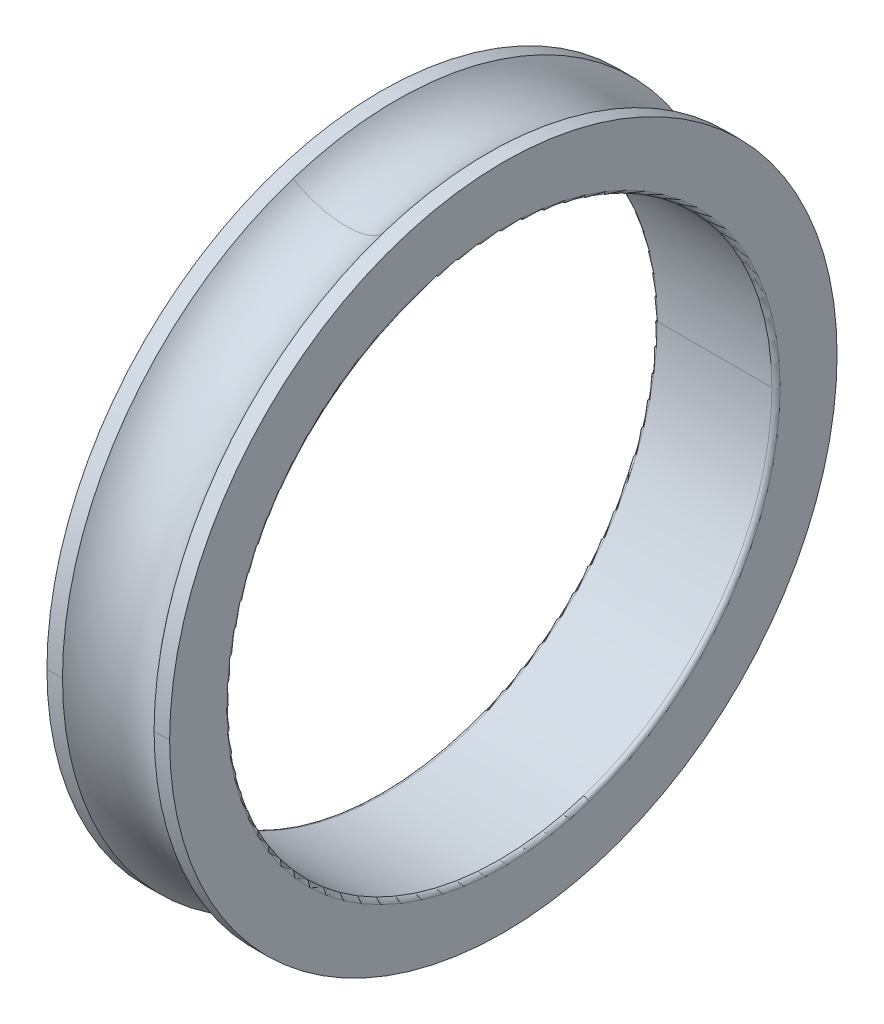
ISO-10303-21;
HEADER;
FILE_DESCRIPTION(('STEP AP214'),'2;1');
FILE_NAME('part.step','',(''),(''),'','','');
FILE_SCHEMA(('AUTOMOTIVE_DESIGN { 1 0 10303 214 1 1 1 1 }'));
ENDSEC;
DATA;
#1=APPLICATION_CONTEXT('core data for automotive mechanical design processes');
#2=APPLICATION_PROTOCOL_DEFINITION('international standard','automotive_design',2000,#1);
#3=PRODUCT_CONTEXT('',#1,'mechanical');
#4=PRODUCT('Part','Part','',(#3));
#5=PRODUCT_RELATED_PRODUCT_CATEGORY('part','',(#4));
#6=PRODUCT_DEFINITION_FORMATION('','',#4);
#7=PRODUCT_DEFINITION_CONTEXT('part definition',#1,'design');
#8=PRODUCT_DEFINITION('design','',#6,#7);
#9=PRODUCT_DEFINITION_SHAPE('','',#8);
#10=(LENGTH_UNIT() NAMED_UNIT(*) SI_UNIT(.MILLI.,.METRE.));
#11=(NAMED_UNIT(*) PLANE_ANGLE_UNIT() SI_UNIT($,.RADIAN.));
#12=(NAMED_UNIT(*) SI_UNIT($,.STERADIAN.) SOLID_ANGLE_UNIT());
#13=UNCERTAINTY_MEASURE_WITH_UNIT(LENGTH_MEASURE(1.E-05),#10,'distance_accuracy_value','');
#14=(GEOMETRIC_REPRESENTATION_CONTEXT(3) GLOBAL_UNCERTAINTY_ASSIGNED_CONTEXT((#13)) GLOBAL_UNIT_ASSIGNED_CONTEXT((#10,
#11,#12)) REPRESENTATION_CONTEXT('',''));
#15=CARTESIAN_POINT('',(0.,0.,0.));
#16=DIRECTION('',(0.,0.,1.));
#17=DIRECTION('',(1.,0.,0.));
#18=AXIS2_PLACEMENT_3D('',#15,#16,#17);
#19=CARTESIAN_POINT('',(0.,24.48,0.));
#20=DIRECTION('',(-1.,0.,0.));
#21=DIRECTION('',(0.,0.,1.));
#22=AXIS2_PLACEMENT_3D('',#19,#20,#21);
#23=PLANE('',#22);
#24=CARTESIAN_POINT('',(0.,0.,0.));
#25=DIRECTION('',(1.,0.,0.));
#26=DIRECTION('',(0.,0.,-1.));
#27=AXIS2_PLACEMENT_3D('',#24,#25,#26);
#28=CIRCLE('',#27,20.3);
#29=CARTESIAN_POINT('',(0.,19.3064472807916,6.27304498581143));
#30=VERTEX_POINT('',#29);
#31=CARTESIAN_POINT('',(0.,-19.3064472807916,-6.27304498581143));
#32=VERTEX_POINT('',#31);
#33=EDGE_CURVE('E11',#30,#32,#28,.T.);
#34=ORIENTED_EDGE('',*,*,#33,.T.);
#35=CARTESIAN_POINT('',(0.,-19.3064472807916,-6.27304498581143));
#36=CARTESIAN_POINT('',(0.,-18.321039656806,-9.30566625738239));
#37=CARTESIAN_POINT('',(0.,-16.7404234910755,-12.1449871080467));
#38=CARTESIAN_POINT('',(0.,-14.6141709386433,-14.6343748217971));
#39=CARTESIAN_POINT('',(0.,-9.50019608369346,-18.645177524688));
#40=CARTESIAN_POINT('',(0.,-3.24946547282107,-20.4249998929224));
#41=CARTESIAN_POINT('',(0.,0.0142870830237632,-20.6818683552697));
#42=CARTESIAN_POINT('',(0.,6.46647707205312,-19.9017700281792));
#43=CARTESIAN_POINT('',(0.,12.1449387161157,-16.7403807115383));
#44=CARTESIAN_POINT('',(0.,14.6343865052819,-14.6141841407228));
#45=CARTESIAN_POINT('',(0.,18.645180456989,-9.50019032872872));
#46=CARTESIAN_POINT('',(0.,20.4249823448355,-3.24946378067093));
#47=CARTESIAN_POINT('',(0.,20.6819314087058,0.0142730783102607));
#48=CARTESIAN_POINT('',(0.,20.2917658258184,3.24039477073223));
#49=CARTESIAN_POINT('',(0.,19.3064472807916,6.27304498581143));
#50=B_SPLINE_CURVE_WITH_KNOTS('',5,(#35,#36,#37,#38,#39,#40,#41,#42,#43,#44,#45,#46,#47,#48,
#49),.UNSPECIFIED.,.F.,.F.,(6,3,3,3,6),(0.,0.785398163397448,1.5707963267949,2.35619449019234,
3.14159265358979),.UNSPECIFIED.);
#51=EDGE_CURVE('E26',#32,#30,#50,.T.);
#52=ORIENTED_EDGE('',*,*,#51,.T.);
#53=EDGE_LOOP('',(#34,#52));
#54=FACE_BOUND('',#53,.T.);
#55=CARTESIAN_POINT('',(0.,0.,0.));
#56=DIRECTION('',(1.,0.,0.));
#57=DIRECTION('',(0.,0.,-1.));
#58=AXIS2_PLACEMENT_3D('',#55,#56,#57);
#59=CIRCLE('',#58,24.48);
#60=CARTESIAN_POINT('',(0.,0.,24.48));
#61=VERTEX_POINT('',#60);
#62=CARTESIAN_POINT('',(0.,0.,-24.48));
#63=VERTEX_POINT('',#62);
#64=EDGE_CURVE('E318',#61,#63,#59,.T.);
#65=ORIENTED_EDGE('',*,*,#64,.F.);
#66=CARTESIAN_POINT('',(0.,0.,0.));
#67=DIRECTION('',(1.,0.,0.));
#68=DIRECTION('',(0.,0.,-1.));
#69=AXIS2_PLACEMENT_3D('',#66,#67,#68);
#70=CIRCLE('',#69,24.48);
#71=EDGE_CURVE('E313',#63,#61,#70,.T.);
#72=ORIENTED_EDGE('',*,*,#71,.F.);
#73=EDGE_LOOP('',(#65,#72));
#74=FACE_BOUND('',#73,.T.);
#75=ADVANCED_FACE('F17',(#54,#74),#23,.T.);
#76=CARTESIAN_POINT('',(9.,0.,0.));
#77=DIRECTION('',(1.,0.,0.));
#78=DIRECTION('',(0.,-1.,0.));
#79=AXIS2_PLACEMENT_3D('',#76,#77,#78);
#80=CYLINDRICAL_SURFACE('',#79,24.48);
#81=DIRECTION('',(1.,0.,0.));
#82=VECTOR('',#81,1.);
#83=CARTESIAN_POINT('',(0.,0.,24.48));
#84=LINE('',#83,#82);
#85=CARTESIAN_POINT('',(1.14,0.,24.48));
#86=VERTEX_POINT('',#85);
#87=EDGE_CURVE('E309',#61,#86,#84,.T.);
#88=ORIENTED_EDGE('',*,*,#87,.T.);
#89=CARTESIAN_POINT('',(1.14,0.,0.));
#90=DIRECTION('',(1.,0.,0.));
#91=DIRECTION('',(0.,0.,-1.));
#92=AXIS2_PLACEMENT_3D('',#89,#90,#91);
#93=CIRCLE('',#92,24.48);
#94=CARTESIAN_POINT('',(1.14000000000001,23.2818635189054,7.56473602229871));
#95=VERTEX_POINT('',#94);
#96=EDGE_CURVE('E304',#95,#86,#93,.T.);
#97=ORIENTED_EDGE('',*,*,#96,.F.);
#98=CARTESIAN_POINT('',(1.14,0.,0.));
#99=DIRECTION('',(1.,0.,0.));
#100=DIRECTION('',(0.,0.,-1.));
#101=AXIS2_PLACEMENT_3D('',#98,#99,#100);
#102=CIRCLE('',#101,24.48);
#103=CARTESIAN_POINT('',(1.14,0.,-24.48));
#104=VERTEX_POINT('',#103);
#105=EDGE_CURVE('E299',#104,#95,#102,.T.);
#106=ORIENTED_EDGE('',*,*,#105,.F.);
#107=DIRECTION('',(1.,0.,0.));
#108=VECTOR('',#107,1.);
#109=CARTESIAN_POINT('',(0.,0.,-24.48));
#110=LINE('',#109,#108);
#111=EDGE_CURVE('E294',#63,#104,#110,.T.);
#112=ORIENTED_EDGE('',*,*,#111,.F.);
#113=ORIENTED_EDGE('',*,*,#71,.T.);
#114=EDGE_LOOP('',(#88,#97,#106,#112,#113));
#115=FACE_BOUND('',#114,.T.);
#116=ADVANCED_FACE('F339',(#115),#80,.T.);
#117=CARTESIAN_POINT('',(9.,0.,0.));
#118=DIRECTION('',(1.,0.,0.));
#119=DIRECTION('',(0.,1.,0.));
#120=AXIS2_PLACEMENT_3D('',#117,#118,#119);
#121=CYLINDRICAL_SURFACE('',#120,24.48);
#122=ORIENTED_EDGE('',*,*,#87,.F.);
#123=ORIENTED_EDGE('',*,*,#64,.T.);
#124=ORIENTED_EDGE('',*,*,#111,.T.);
#125=CARTESIAN_POINT('',(1.14,0.,0.));
#126=DIRECTION('',(1.,0.,0.));
#127=DIRECTION('',(0.,0.,-1.));
#128=AXIS2_PLACEMENT_3D('',#125,#126,#127);
#129=CIRCLE('',#128,24.48);
#130=CARTESIAN_POINT('',(1.14000000000001,-23.2818635189054,-7.56473602229871));
#131=VERTEX_POINT('',#130);
#132=EDGE_CURVE('E289',#131,#104,#129,.T.);
#133=ORIENTED_EDGE('',*,*,#132,.F.);
#134=CARTESIAN_POINT('',(1.14,0.,0.));
#135=DIRECTION('',(1.,0.,0.));
#136=DIRECTION('',(0.,0.,-1.));
#137=AXIS2_PLACEMENT_3D('',#134,#135,#136);
#138=CIRCLE('',#137,24.48);
#139=EDGE_CURVE('E284',#86,#131,#138,.T.);
#140=ORIENTED_EDGE('',*,*,#139,.F.);
#141=EDGE_LOOP('',(#122,#123,#124,#133,#140));
#142=FACE_BOUND('',#141,.T.);
#143=ADVANCED_FACE('F334',(#142),#121,.T.);
#144=CARTESIAN_POINT('',(4.5,0.,0.));
#145=DIRECTION('',(1.,0.,0.));
#146=DIRECTION('',(0.,0.309016994374947,-0.951056516295154));
#147=AXIS2_PLACEMENT_3D('',#144,#145,#146);
#148=TOROIDAL_SURFACE('',#147,27.,4.2);
#149=CARTESIAN_POINT('',(4.5,-25.6785259399691,-8.34345884812357));
#150=DIRECTION('',(0.,0.309016994374947,-0.951056516295154));
#151=DIRECTION('',(-0.799999999999998,0.570633909777095,0.185410196624969));
#152=AXIS2_PLACEMENT_3D('',#149,#150,#151);
#153=CIRCLE('',#152,4.2);
#154=CARTESIAN_POINT('',(7.86,-23.2818635189054,-7.56473602229871));
#155=VERTEX_POINT('',#154);
#156=EDGE_CURVE('E280',#131,#155,#153,.T.);
#157=ORIENTED_EDGE('',*,*,#156,.T.);
#158=CARTESIAN_POINT('',(7.86,0.,0.));
#159=DIRECTION('',(1.,0.,0.));
#160=DIRECTION('',(0.,0.,-1.));
#161=AXIS2_PLACEMENT_3D('',#158,#159,#160);
#162=CIRCLE('',#161,24.48);
#163=CARTESIAN_POINT('',(7.86,0.,24.48));
#164=VERTEX_POINT('',#163);
#165=EDGE_CURVE('E275',#164,#155,#162,.T.);
#166=ORIENTED_EDGE('',*,*,#165,.F.);
#167=CARTESIAN_POINT('',(7.86,0.,0.));
#168=DIRECTION('',(1.,0.,0.));
#169=DIRECTION('',(0.,0.,-1.));
#170=AXIS2_PLACEMENT_3D('',#167,#168,#169);
#171=CIRCLE('',#170,24.48);
#172=CARTESIAN_POINT('',(7.86,23.2818635189054,7.56473602229871));
#173=VERTEX_POINT('',#172);
#174=EDGE_CURVE('E270',#173,#164,#171,.T.);
#175=ORIENTED_EDGE('',*,*,#174,.F.);
#176=CARTESIAN_POINT('',(4.5,25.6785259399691,8.34345884812358));
#177=DIRECTION('',(0.,-0.309016994374947,0.951056516295154));
#178=DIRECTION('',(-0.799999999999999,-0.570633909777094,-0.185410196624969));
#179=AXIS2_PLACEMENT_3D('',#176,#177,#178);
#180=CIRCLE('',#179,4.2);
#181=EDGE_CURVE('E265',#95,#173,#180,.T.);
#182=ORIENTED_EDGE('',*,*,#181,.F.);
#183=ORIENTED_EDGE('',*,*,#96,.T.);
#184=ORIENTED_EDGE('',*,*,#139,.T.);
#185=EDGE_LOOP('',(#157,#166,#175,#182,#183,#184));
#186=FACE_BOUND('',#185,.T.);
#187=ADVANCED_FACE('F346',(#186),#148,.F.);
#188=CARTESIAN_POINT('',(4.5,0.,0.));
#189=DIRECTION('',(1.,0.,0.));
#190=DIRECTION('',(0.,-0.309016994374947,0.951056516295154));
#191=AXIS2_PLACEMENT_3D('',#188,#189,#190);
#192=TOROIDAL_SURFACE('',#191,27.,4.2);
#193=ORIENTED_EDGE('',*,*,#156,.F.);
#194=ORIENTED_EDGE('',*,*,#132,.T.);
#195=ORIENTED_EDGE('',*,*,#105,.T.);
#196=ORIENTED_EDGE('',*,*,#181,.T.);
#197=CARTESIAN_POINT('',(7.86,0.,0.));
#198=DIRECTION('',(1.,0.,0.));
#199=DIRECTION('',(0.,0.,-1.));
#200=AXIS2_PLACEMENT_3D('',#197,#198,#199);
#201=CIRCLE('',#200,24.48);
#202=CARTESIAN_POINT('',(7.86,0.,-24.48));
#203=VERTEX_POINT('',#202);
#204=EDGE_CURVE('E260',#203,#173,#201,.T.);
#205=ORIENTED_EDGE('',*,*,#204,.F.);
#206=CARTESIAN_POINT('',(7.86,0.,0.));
#207=DIRECTION('',(1.,0.,0.));
#208=DIRECTION('',(0.,0.,-1.));
#209=AXIS2_PLACEMENT_3D('',#206,#207,#208);
#210=CIRCLE('',#209,24.48);
#211=EDGE_CURVE('E255',#155,#203,#210,.T.);
#212=ORIENTED_EDGE('',*,*,#211,.F.);
#213=EDGE_LOOP('',(#193,#194,#195,#196,#205,#212));
#214=FACE_BOUND('',#213,.T.);
#215=ADVANCED_FACE('F343',(#214),#192,.F.);
#216=CARTESIAN_POINT('',(9.,0.,0.));
#217=DIRECTION('',(1.,0.,0.));
#218=DIRECTION('',(0.,1.,0.));
#219=AXIS2_PLACEMENT_3D('',#216,#217,#218);
#220=CYLINDRICAL_SURFACE('',#219,24.48);
#221=DIRECTION('',(1.,0.,0.));
#222=VECTOR('',#221,1.);
#223=CARTESIAN_POINT('',(7.86,0.,24.48));
#224=LINE('',#223,#222);
#225=CARTESIAN_POINT('',(9.,0.,24.48));
#226=VERTEX_POINT('',#225);
#227=EDGE_CURVE('E250',#164,#226,#224,.T.);
#228=ORIENTED_EDGE('',*,*,#227,.F.);
#229=ORIENTED_EDGE('',*,*,#165,.T.);
#230=ORIENTED_EDGE('',*,*,#211,.T.);
#231=DIRECTION('',(1.,0.,0.));
#232=VECTOR('',#231,1.);
#233=CARTESIAN_POINT('',(7.86,0.,-24.48));
#234=LINE('',#233,#232);
#235=CARTESIAN_POINT('',(9.,0.,-24.48));
#236=VERTEX_POINT('',#235);
#237=EDGE_CURVE('E246',#203,#236,#234,.T.);
#238=ORIENTED_EDGE('',*,*,#237,.T.);
#239=CARTESIAN_POINT('',(9.,0.,0.));
#240=DIRECTION('',(1.,0.,0.));
#241=DIRECTION('',(0.,0.,-1.));
#242=AXIS2_PLACEMENT_3D('',#239,#240,#241);
#243=CIRCLE('',#242,24.48);
#244=EDGE_CURVE('E241',#226,#236,#243,.T.);
#245=ORIENTED_EDGE('',*,*,#244,.F.);
#246=EDGE_LOOP('',(#228,#229,#230,#238,#245));
#247=FACE_BOUND('',#246,.T.);
#248=ADVANCED_FACE('F353',(#247),#220,.T.);
#249=CARTESIAN_POINT('',(9.,20.3,0.));
#250=DIRECTION('',(1.,0.,0.));
#251=DIRECTION('',(0.,0.,-1.));
#252=AXIS2_PLACEMENT_3D('',#249,#250,#251);
#253=PLANE('',#252);
#254=CARTESIAN_POINT('',(9.,0.,0.));
#255=DIRECTION('',(1.,0.,0.));
#256=DIRECTION('',(0.,0.,-1.));
#257=AXIS2_PLACEMENT_3D('',#254,#255,#256);
#258=CIRCLE('',#257,24.48);
#259=EDGE_CURVE('E238',#236,#226,#258,.T.);
#260=ORIENTED_EDGE('',*,*,#259,.T.);
#261=ORIENTED_EDGE('',*,*,#244,.T.);
#262=EDGE_LOOP('',(#260,#261));
#263=FACE_BOUND('',#262,.T.);
#264=CARTESIAN_POINT('',(9.,-19.3064472807916,-6.27304498581147));
#265=CARTESIAN_POINT('',(9.,-19.2038114196328,-6.58894848704194));
#266=CARTESIAN_POINT('',(9.,-19.0934092030368,-6.90232791603218));
#267=CARTESIAN_POINT('',(9.,-18.8573669791918,-7.52329467595277));
#268=CARTESIAN_POINT('',(9.,-18.7317269719428,-7.83088200688312));
#269=CARTESIAN_POINT('',(9.,-18.4655040870129,-8.43952061710446));
#270=CARTESIAN_POINT('',(9.,-18.3249212093321,-8.74057189639547));
#271=CARTESIAN_POINT('',(9.,-18.0291533386369,-9.3354139345546));
#272=CARTESIAN_POINT('',(9.,-17.8739683456225,-9.62920469342273));
#273=CARTESIAN_POINT('',(9.,-17.549369541533,-10.2088177113537));
#274=CARTESIAN_POINT('',(9.,-17.3799557304579,-10.4946399704165));
#275=CARTESIAN_POINT('',(9.,-17.027307572196,-11.0576274746076));
#276=CARTESIAN_POINT('',(9.,-16.8440732250091,-11.3347927197358));
#277=CARTESIAN_POINT('',(9.,-16.4642253821268,-11.8797984655052));
#278=CARTESIAN_POINT('',(9.,-16.2676118864314,-12.1476389661464));
#279=CARTESIAN_POINT('',(9.,-15.8614794163794,-12.6733499757884));
#280=CARTESIAN_POINT('',(9.,-15.6519604420228,-12.9312204847892));
#281=CARTESIAN_POINT('',(9.,-15.2205217613384,-13.4363702774163));
#282=CARTESIAN_POINT('',(9.,-14.9986020550105,-13.6836495610425));
#283=CARTESIAN_POINT('',(9.,-14.5428965351632,-14.1670211857594));
#284=CARTESIAN_POINT('',(9.,-14.3091107216437,-14.40311352685));
#285=CARTESIAN_POINT('',(9.,-13.8302361977091,-14.8635424992885));
#286=CARTESIAN_POINT('',(9.,-13.5851474872939,-15.0878791306363));
#287=CARTESIAN_POINT('',(9.,-13.0842576097936,-15.5242562370156));
#288=CARTESIAN_POINT('',(9.,-12.8284564427085,-15.7362967120471));
#289=CARTESIAN_POINT('',(9.,-12.3067578992707,-16.1475706817112));
#290=CARTESIAN_POINT('',(9.,-12.040860522918,-16.3468041763438));
#291=CARTESIAN_POINT('',(9.,-11.4996101310184,-16.7319842142723));
#292=CARTESIAN_POINT('',(9.,-11.2242571154715,-16.9179307575682));
#293=CARTESIAN_POINT('',(9.,-10.6647587947151,-17.2760889313131));
#294=CARTESIAN_POINT('',(9.,-10.3806134895055,-17.448300561762));
#295=CARTESIAN_POINT('',(9.,-9.80421512035229,-17.7785740369115));
#296=CARTESIAN_POINT('',(9.,-9.51196205640871,-17.9366358816119));
#297=CARTESIAN_POINT('',(9.,-8.92005223301687,-18.2382290004358));
#298=CARTESIAN_POINT('',(9.,-8.62039547356862,-18.3817602745593));
#299=CARTESIAN_POINT('',(9.,-8.01440015854779,-18.6539464728179));
#300=CARTESIAN_POINT('',(9.,-7.70806160297523,-18.7826013969531));
#301=CARTESIAN_POINT('',(9.,-7.08944069211824,-19.0247249542543));
#302=CARTESIAN_POINT('',(9.,-6.77715833683381,-19.1381935874202));
#303=CARTESIAN_POINT('',(9.,-6.1474021420997,-19.3496712069067));
#304=CARTESIAN_POINT('',(9.,-5.82992830265001,-19.4476801932274));
#305=CARTESIAN_POINT('',(9.,-5.19055396187201,-19.6280024067907));
#306=CARTESIAN_POINT('',(9.,-4.86865346054371,-19.7103156340334));
#307=CARTESIAN_POINT('',(9.,-4.22120128251134,-19.8590480296668));
#308=CARTESIAN_POINT('',(9.,-3.89564960580728,-19.9254671980574));
#309=CARTESIAN_POINT('',(9.,-3.24167935952753,-20.0422514663922));
#310=CARTESIAN_POINT('',(9.,-2.91326078995185,-20.0926165663364));
#311=CARTESIAN_POINT('',(9.,-2.25434794702904,-20.1771713638412));
#312=CARTESIAN_POINT('',(9.,-1.92385367368192,-20.2113610614018));
#313=CARTESIAN_POINT('',(9.,-1.2615856128686,-20.2634826881632));
#314=CARTESIAN_POINT('',(9.,-0.929811825402402,-20.2814146173641));
#315=CARTESIAN_POINT('',(9.,-0.265784008464907,-20.300977507818));
#316=CARTESIAN_POINT('',(9.,0.0664700210063933,-20.302608469071));
#317=CARTESIAN_POINT('',(9.,0.730657892895099,-20.2895654945008));
#318=CARTESIAN_POINT('',(9.,1.0625917353125,-20.2748915586775));
#319=CARTESIAN_POINT('',(9.,1.72533957539305,-20.2292741407513));
#320=CARTESIAN_POINT('',(9.,2.0561535730562,-20.1983306586484));
#321=CARTESIAN_POINT('',(9.,2.71586476373198,-20.1202486937216));
#322=CARTESIAN_POINT('',(9.,3.04476195674461,-20.0731102108978));
#323=CARTESIAN_POINT('',(9.,3.69984719597342,-19.9627518052631));
#324=CARTESIAN_POINT('',(9.,4.02603524218959,-19.8995318824523));
#325=CARTESIAN_POINT('',(9.,4.67491637225143,-19.7571628991751));
#326=CARTESIAN_POINT('',(9.,4.9976094560971,-19.6780138387088));
#327=CARTESIAN_POINT('',(9.,5.63872326551437,-19.50397725714));
#328=CARTESIAN_POINT('',(9.,5.95714399108597,-19.4090897360375));
#329=CARTESIAN_POINT('',(9.,6.58894598053685,-19.2038048255458));
#330=CARTESIAN_POINT('',(9.,6.90232724441613,-19.0934074361566));
#331=CARTESIAN_POINT('',(9.,7.52329534756872,-18.8573687460721));
#332=CARTESIAN_POINT('',(9.,7.83088218684203,-18.7317274453769));
#333=CARTESIAN_POINT('',(9.,8.43952043714545,-18.4655036135788));
#334=CARTESIAN_POINT('',(9.,8.74057184817556,-18.3249210824759));
#335=CARTESIAN_POINT('',(9.,9.33541398277441,-18.0291534654933));
#336=CARTESIAN_POINT('',(9.,9.62920470634315,-17.8739683796136));
#337=CARTESIAN_POINT('',(9.,10.2088176984332,-17.549369507542));
#338=CARTESIAN_POINT('',(9.,10.4946399669544,-17.3799557213501));
#339=CARTESIAN_POINT('',(9.,11.0576274780696,-17.0273075813039));
#340=CARTESIAN_POINT('',(9.,11.3347927206635,-16.8440732274495));
#341=CARTESIAN_POINT('',(9.,11.8797984645776,-16.4642253796863));
#342=CARTESIAN_POINT('',(9.,12.1476389658978,-16.2676118857775));
#343=CARTESIAN_POINT('',(9.,12.6733499760369,-15.8614794170334));
#344=CARTESIAN_POINT('',(9.,12.9312204848558,-15.6519604421981));
#345=CARTESIAN_POINT('',(9.,13.4363702773496,-15.2205217611632));
#346=CARTESIAN_POINT('',(9.,13.6836495610246,-14.9986020549636));
#347=CARTESIAN_POINT('',(9.,14.1670211857772,-14.5428965352102));
#348=CARTESIAN_POINT('',(9.,14.4031135268548,-14.3091107216563));
#349=CARTESIAN_POINT('',(9.,14.8635424992837,-13.8302361976965));
#350=CARTESIAN_POINT('',(9.,15.087879130635,-13.5851474872905));
#351=CARTESIAN_POINT('',(9.,15.5242562370168,-13.084257609797));
#352=CARTESIAN_POINT('',(9.,15.7362967120474,-12.8284564427095));
#353=CARTESIAN_POINT('',(9.,16.1475706817108,-12.3067578992699));
#354=CARTESIAN_POINT('',(9.,16.3468041763437,-12.0408605229178));
#355=CARTESIAN_POINT('',(9.,16.7319842142724,-11.4996101310187));
#356=CARTESIAN_POINT('',(9.,16.9179307575682,-11.2242571154717));
#357=CARTESIAN_POINT('',(9.,17.276088931313,-10.664758794715));
#358=CARTESIAN_POINT('',(9.,17.448300561762,-10.3806134895055));
#359=CARTESIAN_POINT('',(9.,17.7785740369114,-9.80421512035236));
#360=CARTESIAN_POINT('',(9.,17.9366358816119,-9.51196205640877));
#361=CARTESIAN_POINT('',(9.,18.2382290004358,-8.92005223301692));
#362=CARTESIAN_POINT('',(9.,18.3817602745592,-8.62039547356867));
#363=CARTESIAN_POINT('',(9.,18.6539464728179,-8.01440015854784));
#364=CARTESIAN_POINT('',(9.,18.7826013969532,-7.70806160297526));
#365=CARTESIAN_POINT('',(9.,19.0247249542542,-7.08944069211831));
#366=CARTESIAN_POINT('',(9.,19.1381935874199,-6.77715833683393));
#367=CARTESIAN_POINT('',(9.,19.349671206907,-6.14740214209968));
#368=CARTESIAN_POINT('',(9.,19.4476801932283,-5.82992830264981));
#369=CARTESIAN_POINT('',(9.,19.6280024067898,-5.19055396187232));
#370=CARTESIAN_POINT('',(9.,19.7103156340299,-4.8686534605447));
#371=CARTESIAN_POINT('',(9.,19.8590480296702,-4.22120128251045));
#372=CARTESIAN_POINT('',(9.,19.9254671980704,-3.8956496058038));
#373=CARTESIAN_POINT('',(9.,20.0422514663792,-3.24167935953111));
#374=CARTESIAN_POINT('',(9.,20.0926165662879,-2.91326078996506));
#375=CARTESIAN_POINT('',(9.,20.1771713638897,-2.25434794701594));
#376=CARTESIAN_POINT('',(9.,20.2113610615827,-1.92385367363287));
#377=CARTESIAN_POINT('',(9.,20.2634826879823,-1.26158561291777));
#378=CARTESIAN_POINT('',(9.,20.2814146166889,-0.929811825585742));
#379=CARTESIAN_POINT('',(9.,20.3009775084931,-0.265784008281707));
#380=CARTESIAN_POINT('',(9.,20.3026084715907,0.0664700216903009));
#381=CARTESIAN_POINT('',(9.,20.2895654919812,0.730657892211055));
#382=CARTESIAN_POINT('',(9.,20.2748915492742,1.0625917327598));
#383=CARTESIAN_POINT('',(9.,20.2292741501547,1.72533957794562));
#384=CARTESIAN_POINT('',(9.,20.1983306937422,2.05615358258269));
#385=CARTESIAN_POINT('',(9.,20.1202486586278,2.71586475420538));
#386=CARTESIAN_POINT('',(9.,20.073110079926,3.04476192119099));
#387=CARTESIAN_POINT('',(9.,19.9627519362349,3.69984723152695));
#388=CARTESIAN_POINT('',(9.,19.8995323712458,4.02603537487729));
#389=CARTESIAN_POINT('',(9.,19.7571624103817,4.67491623956363));
#390=CARTESIAN_POINT('',(9.,19.6780120145067,4.99760896089961));
#391=CARTESIAN_POINT('',(9.,19.5039790813422,5.63872376071174));
#392=CARTESIAN_POINT('',(9.,19.4090965440527,5.95714583918788));
#393=CARTESIAN_POINT('',(9.,19.3064472807916,6.27304498581136));
#394=B_SPLINE_CURVE_WITH_KNOTS('',3,(#264,#265,#266,#267,#268,#269,#270,#271,#272,#273,#274,
#275,#276,#277,#278,#279,#280,#281,#282,#283,#284,#285,#286,#287,#288,#289,#290,#291,#292,#293,
#294,#295,#296,#297,#298,#299,#300,#301,#302,#303,#304,#305,#306,#307,#308,#309,#310,#311,#312,
#313,#314,#315,#316,#317,#318,#319,#320,#321,#322,#323,#324,#325,#326,#327,#328,#329,#330,#331,
#332,#333,#334,#335,#336,#337,#338,#339,#340,#341,#342,#343,#344,#345,#346,#347,#348,#349,#350,
#351,#352,#353,#354,#355,#356,#357,#358,#359,#360,#361,#362,#363,#364,#365,#366,#367,#368,#369,
#370,#371,#372,#373,#374,#375,#376,#377,#378,#379,#380,#381,#382,#383,#384,#385,#386,#387,#388,
#389,#390,#391,#392,#393),.UNSPECIFIED.,.F.,.F.,(4,2,2,2,2,2,2,2,2,2,2,2,2,2,2,2,2,2,2,2,2,2,2,
2,2,2,2,2,2,2,2,2,2,2,2,2,2,2,2,2,2,2,2,2,2,2,2,2,2,2,2,2,2,2,2,2,2,2,2,2,2,2,2,2,4),(0.,
0.996373878030235,1.99274775606048,2.98912163409071,3.98549551212095,4.98186939015118,
5.97824326818142,6.97461714621166,7.9709910242419,8.96736490227213,9.96373878030237,
10.9601126583326,11.9564865363628,12.9528604143931,13.9492342924233,14.9456081704536,
15.9419820484838,16.938355926514,17.9347298045443,18.9311036825745,19.9274775606047,
20.923851438635,21.9202253166652,22.9165991946954,23.9129730727257,24.9093469507559,
25.9057208287862,26.9020947068164,27.8984685848466,28.8948424628769,29.8912163409071,
30.8875902189373,31.8839640969676,32.8803379749978,33.8767118530281,34.8730857310583,
35.8694596090885,36.8658334871188,37.862207365149,38.8585812431793,39.8549551212095,
40.8513289992397,41.84770287727,42.8440767553002,43.8404506333304,44.8368245113607,
45.8331983893909,46.8295722674211,47.8259461454514,48.8223200234816,49.8186939015118,
50.8150677795421,51.8114416575723,52.8078155356026,53.8041894136328,54.800563291663,
55.7969371696933,56.7933110477235,57.7896849257537,58.786058803784,59.7824326818142,
60.7788065598444,61.7751804378747,62.7715543159049,63.7679281939351),.UNSPECIFIED.);
#395=CARTESIAN_POINT('',(9.,-19.3064472807916,-6.27304498581143));
#396=VERTEX_POINT('',#395);
#397=CARTESIAN_POINT('',(9.,19.3064472807916,6.27304498581143));
#398=VERTEX_POINT('',#397);
#399=EDGE_CURVE('E237',#396,#398,#394,.T.);
#400=ORIENTED_EDGE('',*,*,#399,.F.);
#401=CARTESIAN_POINT('',(9.,19.3064472807916,6.27304498581147));
#402=CARTESIAN_POINT('',(9.,19.2038114196328,6.58894848704194));
#403=CARTESIAN_POINT('',(9.,19.0934092030368,6.90232791603219));
#404=CARTESIAN_POINT('',(9.,18.8573669791918,7.52329467595277));
#405=CARTESIAN_POINT('',(9.,18.7317269719428,7.83088200688312));
#406=CARTESIAN_POINT('',(9.,18.4655040870129,8.43952061710447));
#407=CARTESIAN_POINT('',(9.,18.3249212093321,8.74057189639547));
#408=CARTESIAN_POINT('',(9.,18.0291533386369,9.3354139345546));
#409=CARTESIAN_POINT('',(9.,17.8739683456225,9.62920469342273));
#410=CARTESIAN_POINT('',(9.,17.549369541533,10.2088177113537));
#411=CARTESIAN_POINT('',(9.,17.3799557304579,10.4946399704165));
#412=CARTESIAN_POINT('',(9.,17.027307572196,11.0576274746076));
#413=CARTESIAN_POINT('',(9.,16.8440732250091,11.3347927197359));
#414=CARTESIAN_POINT('',(9.,16.4642253821268,11.8797984655053));
#415=CARTESIAN_POINT('',(9.,16.2676118864314,12.1476389661464));
#416=CARTESIAN_POINT('',(9.,15.8614794163794,12.6733499757884));
#417=CARTESIAN_POINT('',(9.,15.6519604420228,12.9312204847892));
#418=CARTESIAN_POINT('',(9.,15.2205217613384,13.4363702774163));
#419=CARTESIAN_POINT('',(9.,14.9986020550105,13.6836495610425));
#420=CARTESIAN_POINT('',(9.,14.5428965351632,14.1670211857594));
#421=CARTESIAN_POINT('',(9.,14.3091107216437,14.40311352685));
#422=CARTESIAN_POINT('',(9.,13.8302361977091,14.8635424992885));
#423=CARTESIAN_POINT('',(9.,13.5851474872939,15.0878791306363));
#424=CARTESIAN_POINT('',(9.,13.0842576097936,15.5242562370156));
#425=CARTESIAN_POINT('',(9.,12.8284564427085,15.7362967120471));
#426=CARTESIAN_POINT('',(9.,12.3067578992707,16.1475706817112));
#427=CARTESIAN_POINT('',(9.,12.040860522918,16.3468041763438));
#428=CARTESIAN_POINT('',(9.,11.4996101310184,16.7319842142723));
#429=CARTESIAN_POINT('',(9.,11.2242571154715,16.9179307575682));
#430=CARTESIAN_POINT('',(9.,10.664758794715,17.2760889313131));
#431=CARTESIAN_POINT('',(9.,10.3806134895055,17.448300561762));
#432=CARTESIAN_POINT('',(9.,9.80421512035228,17.7785740369115));
#433=CARTESIAN_POINT('',(9.,9.5119620564087,17.9366358816119));
#434=CARTESIAN_POINT('',(9.,8.92005223301686,18.2382290004358));
#435=CARTESIAN_POINT('',(9.,8.62039547356861,18.3817602745593));
#436=CARTESIAN_POINT('',(9.,8.01440015854778,18.6539464728179));
#437=CARTESIAN_POINT('',(9.,7.70806160297521,18.7826013969532));
#438=CARTESIAN_POINT('',(9.,7.08944069211822,19.0247249542543));
#439=CARTESIAN_POINT('',(9.,6.7771583368338,19.1381935874202));
#440=CARTESIAN_POINT('',(9.,6.14740214209968,19.3496712069067));
#441=CARTESIAN_POINT('',(9.,5.82992830264999,19.4476801932274));
#442=CARTESIAN_POINT('',(9.,5.19055396187199,19.6280024067907));
#443=CARTESIAN_POINT('',(9.,4.86865346054369,19.7103156340334));
#444=CARTESIAN_POINT('',(9.,4.22120128251131,19.8590480296668));
#445=CARTESIAN_POINT('',(9.,3.89564960580724,19.9254671980574));
#446=CARTESIAN_POINT('',(9.,3.24167935952749,20.0422514663922));
#447=CARTESIAN_POINT('',(9.,2.91326078995181,20.0926165663364));
#448=CARTESIAN_POINT('',(9.,2.25434794702901,20.1771713638412));
#449=CARTESIAN_POINT('',(9.,1.92385367368189,20.2113610614018));
#450=CARTESIAN_POINT('',(9.,1.26158561286857,20.2634826881632));
#451=CARTESIAN_POINT('',(9.,0.929811825402379,20.2814146173641));
#452=CARTESIAN_POINT('',(9.,0.265784008464884,20.300977507818));
#453=CARTESIAN_POINT('',(9.,-0.0664700210064187,20.302608469071));
#454=CARTESIAN_POINT('',(9.,-0.730657892895124,20.2895654945008));
#455=CARTESIAN_POINT('',(9.,-1.06259173531253,20.2748915586775));
#456=CARTESIAN_POINT('',(9.,-1.72533957539308,20.2292741407513));
#457=CARTESIAN_POINT('',(9.,-2.05615357305622,20.1983306586484));
#458=CARTESIAN_POINT('',(9.,-2.71586476373201,20.1202486937216));
#459=CARTESIAN_POINT('',(9.,-3.04476195674464,20.0731102108978));
#460=CARTESIAN_POINT('',(9.,-3.69984719597345,19.9627518052631));
#461=CARTESIAN_POINT('',(9.,-4.02603524218962,19.8995318824523));
#462=CARTESIAN_POINT('',(9.,-4.67491637225146,19.7571628991751));
#463=CARTESIAN_POINT('',(9.,-4.99760945609713,19.6780138387088));
#464=CARTESIAN_POINT('',(9.,-5.6387232655144,19.50397725714));
#465=CARTESIAN_POINT('',(9.,-5.957143991086,19.4090897360375));
#466=CARTESIAN_POINT('',(9.,-6.58894598053688,19.2038048255458));
#467=CARTESIAN_POINT('',(9.,-6.90232724441616,19.0934074361565));
#468=CARTESIAN_POINT('',(9.,-7.52329534756875,18.8573687460721));
#469=CARTESIAN_POINT('',(9.,-7.83088218684206,18.7317274453769));
#470=CARTESIAN_POINT('',(9.,-8.43952043714548,18.4655036135788));
#471=CARTESIAN_POINT('',(9.,-8.74057184817558,18.3249210824758));
#472=CARTESIAN_POINT('',(9.,-9.33541398277443,18.0291534654932));
#473=CARTESIAN_POINT('',(9.,-9.62920470634318,17.8739683796136));
#474=CARTESIAN_POINT('',(9.,-10.2088176984332,17.549369507542));
#475=CARTESIAN_POINT('',(9.,-10.4946399669545,17.3799557213501));
#476=CARTESIAN_POINT('',(9.,-11.0576274780696,17.0273075813038));
#477=CARTESIAN_POINT('',(9.,-11.3347927206635,16.8440732274495));
#478=CARTESIAN_POINT('',(9.,-11.8797984645776,16.4642253796863));
#479=CARTESIAN_POINT('',(9.,-12.1476389658978,16.2676118857775));
#480=CARTESIAN_POINT('',(9.,-12.6733499760369,15.8614794170333));
#481=CARTESIAN_POINT('',(9.,-12.9312204848558,15.6519604421981));
#482=CARTESIAN_POINT('',(9.,-13.4363702773497,15.2205217611632));
#483=CARTESIAN_POINT('',(9.,-13.6836495610246,14.9986020549636));
#484=CARTESIAN_POINT('',(9.,-14.1670211857772,14.5428965352101));
#485=CARTESIAN_POINT('',(9.,-14.4031135268548,14.3091107216563));
#486=CARTESIAN_POINT('',(9.,-14.8635424992837,13.8302361976965));
#487=CARTESIAN_POINT('',(9.,-15.087879130635,13.5851474872905));
#488=CARTESIAN_POINT('',(9.,-15.5242562370169,13.084257609797));
#489=CARTESIAN_POINT('',(9.,-15.7362967120474,12.8284564427094));
#490=CARTESIAN_POINT('',(9.,-16.1475706817108,12.3067578992698));
#491=CARTESIAN_POINT('',(9.,-16.3468041763437,12.0408605229178));
#492=CARTESIAN_POINT('',(9.,-16.7319842142724,11.4996101310187));
#493=CARTESIAN_POINT('',(9.,-16.9179307575682,11.2242571154716));
#494=CARTESIAN_POINT('',(9.,-17.276088931313,10.664758794715));
#495=CARTESIAN_POINT('',(9.,-17.448300561762,10.3806134895055));
#496=CARTESIAN_POINT('',(9.,-17.7785740369115,9.80421512035231));
#497=CARTESIAN_POINT('',(9.,-17.9366358816119,9.51196205640872));
#498=CARTESIAN_POINT('',(9.,-18.2382290004358,8.92005223301688));
#499=CARTESIAN_POINT('',(9.,-18.3817602745592,8.62039547356863));
#500=CARTESIAN_POINT('',(9.,-18.6539464728179,8.01440015854781));
#501=CARTESIAN_POINT('',(9.,-18.7826013969532,7.70806160297523));
#502=CARTESIAN_POINT('',(9.,-19.0247249542542,7.08944069211827));
#503=CARTESIAN_POINT('',(9.,-19.1381935874199,6.7771583368339));
#504=CARTESIAN_POINT('',(9.,-19.349671206907,6.14740214209964));
#505=CARTESIAN_POINT('',(9.,-19.4476801932283,5.82992830264976));
#506=CARTESIAN_POINT('',(9.,-19.6280024067898,5.19055396187226));
#507=CARTESIAN_POINT('',(9.,-19.71031563403,4.86865346054465));
#508=CARTESIAN_POINT('',(9.,-19.8590480296703,4.22120128251039));
#509=CARTESIAN_POINT('',(9.,-19.9254671980704,3.89564960580375));
#510=CARTESIAN_POINT('',(9.,-20.0422514663792,3.24167935953106));
#511=CARTESIAN_POINT('',(9.,-20.0926165662879,2.91326078996501));
#512=CARTESIAN_POINT('',(9.,-20.1771713638897,2.25434794701589));
#513=CARTESIAN_POINT('',(9.,-20.2113610615827,1.92385367363282));
#514=CARTESIAN_POINT('',(9.,-20.2634826879823,1.26158561291772));
#515=CARTESIAN_POINT('',(9.,-20.2814146166889,0.929811825585687));
#516=CARTESIAN_POINT('',(9.,-20.3009775084931,0.26578400828165));
#517=CARTESIAN_POINT('',(9.,-20.3026084715907,-0.0664700216903575));
#518=CARTESIAN_POINT('',(9.,-20.2895654919812,-0.730657892211111));
#519=CARTESIAN_POINT('',(9.,-20.2748915492742,-1.06259173275986));
#520=CARTESIAN_POINT('',(9.,-20.2292741501547,-1.72533957794568));
#521=CARTESIAN_POINT('',(9.,-20.1983306937422,-2.05615358258275));
#522=CARTESIAN_POINT('',(9.,-20.1202486586278,-2.71586475420544));
#523=CARTESIAN_POINT('',(9.,-20.0731100799259,-3.04476192119105));
#524=CARTESIAN_POINT('',(9.,-19.9627519362349,-3.69984723152701));
#525=CARTESIAN_POINT('',(9.,-19.8995323712458,-4.02603537487735));
#526=CARTESIAN_POINT('',(9.,-19.7571624103816,-4.67491623956368));
#527=CARTESIAN_POINT('',(9.,-19.6780120145067,-4.99760896089967));
#528=CARTESIAN_POINT('',(9.,-19.5039790813422,-5.6387237607118));
#529=CARTESIAN_POINT('',(9.,-19.4090965440527,-5.95714583918794));
#530=CARTESIAN_POINT('',(9.,-19.3064472807916,-6.27304498581141));
#531=B_SPLINE_CURVE_WITH_KNOTS('',3,(#401,#402,#403,#404,#405,#406,#407,#408,#409,#410,#411,
#412,#413,#414,#415,#416,#417,#418,#419,#420,#421,#422,#423,#424,#425,#426,#427,#428,#429,#430,
#431,#432,#433,#434,#435,#436,#437,#438,#439,#440,#441,#442,#443,#444,#445,#446,#447,#448,#449,
#450,#451,#452,#453,#454,#455,#456,#457,#458,#459,#460,#461,#462,#463,#464,#465,#466,#467,#468,
#469,#470,#471,#472,#473,#474,#475,#476,#477,#478,#479,#480,#481,#482,#483,#484,#485,#486,#487,
#488,#489,#490,#491,#492,#493,#494,#495,#496,#497,#498,#499,#500,#501,#502,#503,#504,#505,#506,
#507,#508,#509,#510,#511,#512,#513,#514,#515,#516,#517,#518,#519,#520,#521,#522,#523,#524,#525,
#526,#527,#528,#529,#530),.UNSPECIFIED.,.F.,.F.,(4,2,2,2,2,2,2,2,2,2,2,2,2,2,2,2,2,2,2,2,2,2,2,
2,2,2,2,2,2,2,2,2,2,2,2,2,2,2,2,2,2,2,2,2,2,2,2,2,2,2,2,2,2,2,2,2,2,2,2,2,2,2,2,2,4),(0.,
0.996373878030235,1.99274775606047,2.98912163409071,3.98549551212095,4.98186939015119,
5.97824326818143,6.97461714621166,7.97099102424191,8.96736490227214,9.96373878030238,
10.9601126583326,11.9564865363629,12.9528604143931,13.9492342924233,14.9456081704536,
15.9419820484838,16.938355926514,17.9347298045443,18.9311036825745,19.9274775606048,
20.923851438635,21.9202253166653,22.9165991946955,23.9129730727257,24.909346950756,
25.9057208287862,26.9020947068164,27.8984685848467,28.8948424628769,29.8912163409071,
30.8875902189374,31.8839640969676,32.8803379749979,33.8767118530281,34.8730857310583,
35.8694596090886,36.8658334871188,37.862207365149,38.8585812431793,39.8549551212095,
40.8513289992397,41.84770287727,42.8440767553002,43.8404506333305,44.8368245113607,
45.8331983893909,46.8295722674212,47.8259461454514,48.8223200234816,49.8186939015119,
50.8150677795421,51.8114416575724,52.8078155356026,53.8041894136328,54.8005632916631,
55.7969371696933,56.7933110477235,57.7896849257538,58.786058803784,59.7824326818143,
60.7788065598445,61.7751804378747,62.771554315905,63.7679281939352),.UNSPECIFIED.);
#532=EDGE_CURVE('E200',#398,#396,#531,.T.);
#533=ORIENTED_EDGE('',*,*,#532,.F.);
#534=EDGE_LOOP('',(#400,#533));
#535=FACE_BOUND('',#534,.T.);
#536=ADVANCED_FACE('F185',(#263,#535),#253,.T.);
#537=CARTESIAN_POINT('',(8.70000000000012,0.,0.));
#538=DIRECTION('',(1.,0.,0.));
#539=DIRECTION('',(0.,0.309016994374947,-0.951056516295154));
#540=AXIS2_PLACEMENT_3D('',#537,#538,#539);
#541=TOROIDAL_SURFACE('',#540,20.3,0.29999999999988);
#542=CARTESIAN_POINT('',(8.70000000000012,-19.3064472807916,-6.27304498581143));
#543=DIRECTION('',(0.,0.309016994374948,-0.951056516295154));
#544=DIRECTION('',(-4.02640883597549E-13,0.951056516295154,0.309016994374948));
#545=AXIS2_PLACEMENT_3D('',#542,#543,#544);
#546=CIRCLE('',#545,0.299999999999881);
#547=CARTESIAN_POINT('',(8.7,-19.0211303259032,-6.18033988749898));
#548=VERTEX_POINT('',#547);
#549=EDGE_CURVE('E211',#548,#396,#546,.T.);
#550=ORIENTED_EDGE('',*,*,#549,.F.);
#551=CARTESIAN_POINT('',(8.7,0.,0.));
#552=DIRECTION('',(1.,0.,0.));
#553=DIRECTION('',(0.,0.,-1.));
#554=AXIS2_PLACEMENT_3D('',#551,#552,#553);
#555=CIRCLE('',#554,20.);
#556=CARTESIAN_POINT('',(8.7,0.,20.));
#557=VERTEX_POINT('',#556);
#558=EDGE_CURVE('E206',#557,#548,#555,.T.);
#559=ORIENTED_EDGE('',*,*,#558,.F.);
#560=CARTESIAN_POINT('',(8.7,0.,0.));
#561=DIRECTION('',(1.,0.,0.));
#562=DIRECTION('',(0.,0.,-1.));
#563=AXIS2_PLACEMENT_3D('',#560,#561,#562);
#564=CIRCLE('',#563,20.);
#565=CARTESIAN_POINT('',(8.7,19.0211303259032,6.18033988749898));
#566=VERTEX_POINT('',#565);
#567=EDGE_CURVE('E202',#566,#557,#564,.T.);
#568=ORIENTED_EDGE('',*,*,#567,.F.);
#569=CARTESIAN_POINT('',(8.70000000000012,19.3064472807916,6.27304498581143));
#570=DIRECTION('',(0.,-0.309016994374948,0.951056516295154));
#571=DIRECTION('',(-4.02640883597549E-13,-0.951056516295154,-0.309016994374948));
#572=AXIS2_PLACEMENT_3D('',#569,#570,#571);
#573=CIRCLE('',#572,0.299999999999881);
#574=EDGE_CURVE('E159',#566,#398,#573,.T.);
#575=ORIENTED_EDGE('',*,*,#574,.T.);
#576=ORIENTED_EDGE('',*,*,#532,.T.);
#577=EDGE_LOOP('',(#550,#559,#568,#575,#576));
#578=FACE_BOUND('',#577,.T.);
#579=ADVANCED_FACE('F179',(#578),#541,.T.);
#580=CARTESIAN_POINT('',(8.70000000000012,0.,0.));
#581=DIRECTION('',(1.,0.,0.));
#582=DIRECTION('',(0.,-0.309016994374947,0.951056516295154));
#583=AXIS2_PLACEMENT_3D('',#580,#581,#582);
#584=TOROIDAL_SURFACE('',#583,20.3,0.29999999999988);
#585=ORIENTED_EDGE('',*,*,#549,.T.);
#586=ORIENTED_EDGE('',*,*,#399,.T.);
#587=ORIENTED_EDGE('',*,*,#574,.F.);
#588=CARTESIAN_POINT('',(8.7,0.,0.));
#589=DIRECTION('',(1.,0.,0.));
#590=DIRECTION('',(0.,0.,-1.));
#591=AXIS2_PLACEMENT_3D('',#588,#589,#590);
#592=CIRCLE('',#591,20.);
#593=CARTESIAN_POINT('',(8.7,0.,-20.));
#594=VERTEX_POINT('',#593);
#595=EDGE_CURVE('E154',#594,#566,#592,.T.);
#596=ORIENTED_EDGE('',*,*,#595,.F.);
#597=CARTESIAN_POINT('',(8.7,0.,0.));
#598=DIRECTION('',(1.,0.,0.));
#599=DIRECTION('',(0.,0.,-1.));
#600=AXIS2_PLACEMENT_3D('',#597,#598,#599);
#601=CIRCLE('',#600,20.);
#602=EDGE_CURVE('E149',#548,#594,#601,.T.);
#603=ORIENTED_EDGE('',*,*,#602,.F.);
#604=EDGE_LOOP('',(#585,#586,#587,#596,#603));
#605=FACE_BOUND('',#604,.T.);
#606=ADVANCED_FACE('F168',(#605),#584,.T.);
#607=CARTESIAN_POINT('',(9.,0.,0.));
#608=DIRECTION('',(1.,0.,0.));
#609=DIRECTION('',(0.,1.,0.));
#610=AXIS2_PLACEMENT_3D('',#607,#608,#609);
#611=CYLINDRICAL_SURFACE('',#610,20.);
#612=DIRECTION('',(1.,0.,0.));
#613=VECTOR('',#612,1.);
#614=CARTESIAN_POINT('',(0.300000000000001,0.,20.));
#615=LINE('',#614,#613);
#616=CARTESIAN_POINT('',(0.300000000000001,0.,20.));
#617=VERTEX_POINT('',#616);
#618=EDGE_CURVE('E125',#617,#557,#615,.T.);
#619=ORIENTED_EDGE('',*,*,#618,.T.);
#620=ORIENTED_EDGE('',*,*,#558,.T.);
#621=ORIENTED_EDGE('',*,*,#602,.T.);
#622=DIRECTION('',(1.,0.,0.));
#623=VECTOR('',#622,1.);
#624=CARTESIAN_POINT('',(0.300000000000001,0.,-20.));
#625=LINE('',#624,#623);
#626=CARTESIAN_POINT('',(0.3,0.,-20.));
#627=VERTEX_POINT('',#626);
#628=EDGE_CURVE('E142',#627,#594,#625,.T.);
#629=ORIENTED_EDGE('',*,*,#628,.F.);
#630=CARTESIAN_POINT('',(0.3,0.,0.));
#631=DIRECTION('',(1.,0.,0.));
#632=DIRECTION('',(0.,0.,-1.));
#633=AXIS2_PLACEMENT_3D('',#630,#631,#632);
#634=CIRCLE('',#633,20.);
#635=CARTESIAN_POINT('',(0.3,-19.0211303259031,-6.18033988749896));
#636=VERTEX_POINT('',#635);
#637=EDGE_CURVE('E117',#636,#627,#634,.T.);
#638=ORIENTED_EDGE('',*,*,#637,.F.);
#639=CARTESIAN_POINT('',(0.3,0.,0.));
#640=DIRECTION('',(1.,0.,0.));
#641=DIRECTION('',(0.,0.,-1.));
#642=AXIS2_PLACEMENT_3D('',#639,#640,#641);
#643=CIRCLE('',#642,20.);
#644=EDGE_CURVE('E135',#617,#636,#643,.T.);
#645=ORIENTED_EDGE('',*,*,#644,.F.);
#646=EDGE_LOOP('',(#619,#620,#621,#629,#638,#645));
#647=FACE_BOUND('',#646,.T.);
#648=ADVANCED_FACE('F178',(#647),#611,.F.);
#649=CARTESIAN_POINT('',(0.299999999999941,0.,0.));
#650=DIRECTION('',(1.,0.,0.));
#651=DIRECTION('',(0.,0.309016994374947,-0.951056516295154));
#652=AXIS2_PLACEMENT_3D('',#649,#650,#651);
#653=TOROIDAL_SURFACE('',#652,20.3,0.299999999999941);
#654=CARTESIAN_POINT('',(0.299999999999941,-19.3064472807916,-6.27304498581143));
#655=DIRECTION('',(0.,0.309016994374947,-0.951056516295154));
#656=DIRECTION('',(-1.,0.,0.));
#657=AXIS2_PLACEMENT_3D('',#654,#655,#656);
#658=CIRCLE('',#657,0.299999999999941);
#659=EDGE_CURVE('E110',#32,#636,#658,.T.);
#660=ORIENTED_EDGE('',*,*,#659,.F.);
#661=ORIENTED_EDGE('',*,*,#33,.F.);
#662=CARTESIAN_POINT('',(0.299999999999941,19.3064472807916,6.27304498581143));
#663=DIRECTION('',(0.,-0.309016994374947,0.951056516295154));
#664=DIRECTION('',(-1.,0.,0.));
#665=AXIS2_PLACEMENT_3D('',#662,#663,#664);
#666=CIRCLE('',#665,0.299999999999941);
#667=CARTESIAN_POINT('',(0.3,19.0211303259031,6.18033988749896));
#668=VERTEX_POINT('',#667);
#669=EDGE_CURVE('E103',#30,#668,#666,.T.);
#670=ORIENTED_EDGE('',*,*,#669,.T.);
#671=CARTESIAN_POINT('',(0.3,0.,0.));
#672=DIRECTION('',(1.,0.,0.));
#673=DIRECTION('',(0.,0.,-1.));
#674=AXIS2_PLACEMENT_3D('',#671,#672,#673);
#675=CIRCLE('',#674,20.);
#676=EDGE_CURVE('E108',#668,#617,#675,.T.);
#677=ORIENTED_EDGE('',*,*,#676,.T.);
#678=ORIENTED_EDGE('',*,*,#644,.T.);
#679=EDGE_LOOP('',(#660,#661,#670,#677,#678));
#680=FACE_BOUND('',#679,.T.);
#681=ADVANCED_FACE('F105',(#680),#653,.T.);
#682=CARTESIAN_POINT('',(9.,0.,0.));
#683=DIRECTION('',(1.,0.,0.));
#684=DIRECTION('',(0.,-1.,0.));
#685=AXIS2_PLACEMENT_3D('',#682,#683,#684);
#686=CYLINDRICAL_SURFACE('',#685,20.);
#687=ORIENTED_EDGE('',*,*,#618,.F.);
#688=ORIENTED_EDGE('',*,*,#676,.F.);
#689=CARTESIAN_POINT('',(0.3,0.,0.));
#690=DIRECTION('',(1.,0.,0.));
#691=DIRECTION('',(0.,0.,-1.));
#692=AXIS2_PLACEMENT_3D('',#689,#690,#691);
#693=CIRCLE('',#692,20.);
#694=EDGE_CURVE('E114',#627,#668,#693,.T.);
#695=ORIENTED_EDGE('',*,*,#694,.F.);
#696=ORIENTED_EDGE('',*,*,#628,.T.);
#697=ORIENTED_EDGE('',*,*,#595,.T.);
#698=ORIENTED_EDGE('',*,*,#567,.T.);
#699=EDGE_LOOP('',(#687,#688,#695,#696,#697,#698));
#700=FACE_BOUND('',#699,.T.);
#701=ADVANCED_FACE('F122',(#700),#686,.F.);
#702=CARTESIAN_POINT('',(0.299999999999941,0.,0.));
#703=DIRECTION('',(1.,0.,0.));
#704=DIRECTION('',(0.,-0.309016994374947,0.951056516295154));
#705=AXIS2_PLACEMENT_3D('',#702,#703,#704);
#706=TOROIDAL_SURFACE('',#705,20.3,0.299999999999941);
#707=ORIENTED_EDGE('',*,*,#659,.T.);
#708=ORIENTED_EDGE('',*,*,#637,.T.);
#709=ORIENTED_EDGE('',*,*,#694,.T.);
#710=ORIENTED_EDGE('',*,*,#669,.F.);
#711=ORIENTED_EDGE('',*,*,#51,.F.);
#712=EDGE_LOOP('',(#707,#708,#709,#710,#711));
#713=FACE_BOUND('',#712,.T.);
#714=ADVANCED_FACE('F116',(#713),#706,.T.);
#715=CARTESIAN_POINT('',(9.,0.,0.));
#716=DIRECTION('',(1.,0.,0.));
#717=DIRECTION('',(0.,-1.,0.));
#718=AXIS2_PLACEMENT_3D('',#715,#716,#717);
#719=CYLINDRICAL_SURFACE('',#718,24.48);
#720=ORIENTED_EDGE('',*,*,#227,.T.);
#721=ORIENTED_EDGE('',*,*,#259,.F.);
#722=ORIENTED_EDGE('',*,*,#237,.F.);
#723=ORIENTED_EDGE('',*,*,#204,.T.);
#724=ORIENTED_EDGE('',*,*,#174,.T.);
#725=EDGE_LOOP('',(#720,#721,#722,#723,#724));
#726=FACE_BOUND('',#725,.T.);
#727=ADVANCED_FACE('F350',(#726),#719,.T.);
#728=CLOSED_SHELL('',(#75,#116,#143,#187,#215,#248,#536,#579,#606,#648,#681,#701,#714,#727));
#729=MANIFOLD_SOLID_BREP('B1',#728);
#730=ADVANCED_BREP_SHAPE_REPRESENTATION('',(#18,#729),#14);
#731=SHAPE_DEFINITION_REPRESENTATION(#9,#730);
ENDSEC;
END-ISO-10303-21;
